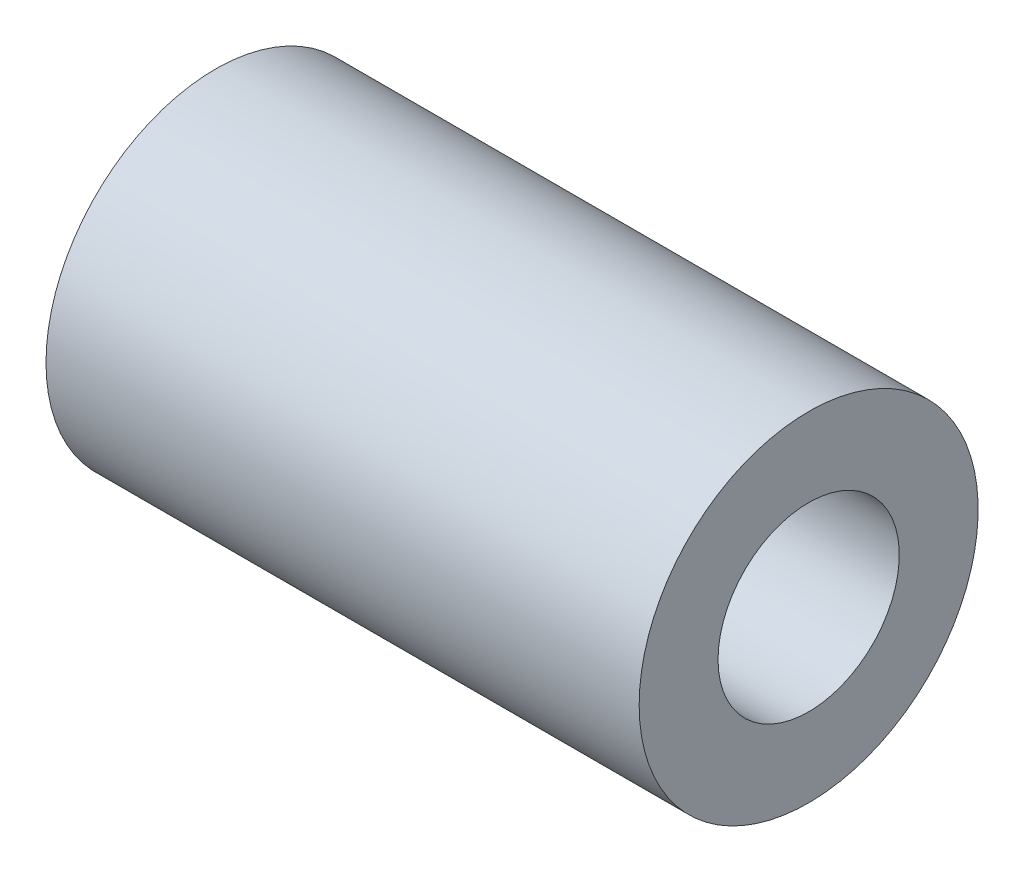
ISO-10303-21;
HEADER;
FILE_DESCRIPTION(('STEP AP214'),'2;1');
FILE_NAME('part.step','',(''),(''),'','','');
FILE_SCHEMA(('AUTOMOTIVE_DESIGN { 1 0 10303 214 1 1 1 1 }'));
ENDSEC;
DATA;
#1=APPLICATION_CONTEXT('core data for automotive mechanical design processes');
#2=APPLICATION_PROTOCOL_DEFINITION('international standard','automotive_design',2000,#1);
#3=PRODUCT_CONTEXT('',#1,'mechanical');
#4=PRODUCT('Part','Part','',(#3));
#5=PRODUCT_RELATED_PRODUCT_CATEGORY('part','',(#4));
#6=PRODUCT_DEFINITION_FORMATION('','',#4);
#7=PRODUCT_DEFINITION_CONTEXT('part definition',#1,'design');
#8=PRODUCT_DEFINITION('design','',#6,#7);
#9=PRODUCT_DEFINITION_SHAPE('','',#8);
#10=(LENGTH_UNIT() NAMED_UNIT(*) SI_UNIT(.MILLI.,.METRE.));
#11=(NAMED_UNIT(*) PLANE_ANGLE_UNIT() SI_UNIT($,.RADIAN.));
#12=(NAMED_UNIT(*) SI_UNIT($,.STERADIAN.) SOLID_ANGLE_UNIT());
#13=UNCERTAINTY_MEASURE_WITH_UNIT(LENGTH_MEASURE(1.E-05),#10,'distance_accuracy_value','');
#14=(GEOMETRIC_REPRESENTATION_CONTEXT(3) GLOBAL_UNCERTAINTY_ASSIGNED_CONTEXT((#13)) GLOBAL_UNIT_ASSIGNED_CONTEXT((#10,
#11,#12)) REPRESENTATION_CONTEXT('',''));
#15=CARTESIAN_POINT('',(0.,0.,0.));
#16=DIRECTION('',(0.,0.,1.));
#17=DIRECTION('',(1.,0.,0.));
#18=AXIS2_PLACEMENT_3D('',#15,#16,#17);
#19=CARTESIAN_POINT('',(0.,0.,0.));
#20=DIRECTION('',(-1.,0.,0.));
#21=DIRECTION('',(0.,0.,1.));
#22=AXIS2_PLACEMENT_3D('',#19,#20,#21);
#23=PLANE('',#22);
#24=CARTESIAN_POINT('',(0.,0.,0.));
#25=DIRECTION('',(-1.,0.,0.));
#26=DIRECTION('',(0.,0.,1.));
#27=AXIS2_PLACEMENT_3D('',#24,#25,#26);
#28=CIRCLE('',#27,5.5);
#29=CARTESIAN_POINT('',(0.,0.,5.5));
#30=VERTEX_POINT('',#29);
#31=EDGE_CURVE('E51',#30,#30,#28,.F.);
#32=ORIENTED_EDGE('',*,*,#31,.F.);
#33=EDGE_LOOP('',(#32));
#34=FACE_BOUND('',#33,.T.);
#35=CARTESIAN_POINT('',(0.,0.,0.));
#36=DIRECTION('',(-1.,0.,0.));
#37=DIRECTION('',(0.,0.,1.));
#38=AXIS2_PLACEMENT_3D('',#35,#36,#37);
#39=CIRCLE('',#38,10.287);
#40=CARTESIAN_POINT('',(0.,0.,10.287));
#41=VERTEX_POINT('',#40);
#42=EDGE_CURVE('E10',#41,#41,#39,.T.);
#43=ORIENTED_EDGE('',*,*,#42,.F.);
#44=EDGE_LOOP('',(#43));
#45=FACE_BOUND('',#44,.T.);
#46=ADVANCED_FACE('F39',(#34,#45),#23,.F.);
#47=CARTESIAN_POINT('',(-1000.,0.,0.));
#48=DIRECTION('',(-1.,0.,0.));
#49=DIRECTION('',(0.,0.,1.));
#50=AXIS2_PLACEMENT_3D('',#47,#48,#49);
#51=CYLINDRICAL_SURFACE('',#50,10.287);
#52=CARTESIAN_POINT('',(-36.,0.,0.));
#53=DIRECTION('',(-1.,0.,0.));
#54=DIRECTION('',(0.,0.,1.));
#55=AXIS2_PLACEMENT_3D('',#52,#53,#54);
#56=CIRCLE('',#55,10.287);
#57=CARTESIAN_POINT('',(-36.,0.,10.287));
#58=VERTEX_POINT('',#57);
#59=EDGE_CURVE('E46',#58,#58,#56,.T.);
#60=ORIENTED_EDGE('',*,*,#59,.F.);
#61=EDGE_LOOP('',(#60));
#62=FACE_BOUND('',#61,.T.);
#63=ORIENTED_EDGE('',*,*,#42,.T.);
#64=EDGE_LOOP('',(#63));
#65=FACE_BOUND('',#64,.T.);
#66=ADVANCED_FACE('F76',(#62,#65),#51,.T.);
#67=CARTESIAN_POINT('',(-36.,10.287,0.));
#68=DIRECTION('',(1.,0.,0.));
#69=DIRECTION('',(0.,0.,-1.));
#70=AXIS2_PLACEMENT_3D('',#67,#68,#69);
#71=PLANE('',#70);
#72=CARTESIAN_POINT('',(-36.,0.,0.));
#73=DIRECTION('',(1.,0.,0.));
#74=DIRECTION('',(0.,0.,-1.));
#75=AXIS2_PLACEMENT_3D('',#72,#73,#74);
#76=CIRCLE('',#75,3.175);
#77=CARTESIAN_POINT('',(-36.,0.,-3.175));
#78=VERTEX_POINT('',#77);
#79=EDGE_CURVE('E45',#78,#78,#76,.F.);
#80=ORIENTED_EDGE('',*,*,#79,.F.);
#81=EDGE_LOOP('',(#80));
#82=FACE_BOUND('',#81,.T.);
#83=ORIENTED_EDGE('',*,*,#59,.T.);
#84=EDGE_LOOP('',(#83));
#85=FACE_BOUND('',#84,.T.);
#86=ADVANCED_FACE('F78',(#82,#85),#71,.F.);
#87=CARTESIAN_POINT('',(-1000.,0.,0.));
#88=DIRECTION('',(-1.,0.,0.));
#89=DIRECTION('',(0.,0.,1.));
#90=AXIS2_PLACEMENT_3D('',#87,#88,#89);
#91=CYLINDRICAL_SURFACE('',#90,5.5);
#92=CARTESIAN_POINT('',(-14.,0.,0.));
#93=DIRECTION('',(-1.,0.,0.));
#94=DIRECTION('',(0.,0.,1.));
#95=AXIS2_PLACEMENT_3D('',#92,#93,#94);
#96=CIRCLE('',#95,5.5);
#97=CARTESIAN_POINT('',(-14.,0.,5.5));
#98=VERTEX_POINT('',#97);
#99=EDGE_CURVE('E54',#98,#98,#96,.T.);
#100=ORIENTED_EDGE('',*,*,#99,.T.);
#101=EDGE_LOOP('',(#100));
#102=FACE_BOUND('',#101,.T.);
#103=ORIENTED_EDGE('',*,*,#31,.T.);
#104=EDGE_LOOP('',(#103));
#105=FACE_BOUND('',#104,.T.);
#106=ADVANCED_FACE('F80',(#102,#105),#91,.F.);
#107=CARTESIAN_POINT('',(-14.,5.5,0.));
#108=DIRECTION('',(1.,0.,0.));
#109=DIRECTION('',(0.,0.,-1.));
#110=AXIS2_PLACEMENT_3D('',#107,#108,#109);
#111=PLANE('',#110);
#112=ORIENTED_EDGE('',*,*,#99,.F.);
#113=EDGE_LOOP('',(#112));
#114=FACE_BOUND('',#113,.T.);
#115=ADVANCED_FACE('F75',(#114),#111,.T.);
#116=CARTESIAN_POINT('',(-1000.,0.,0.));
#117=DIRECTION('',(-1.,0.,0.));
#118=DIRECTION('',(0.,0.,1.));
#119=AXIS2_PLACEMENT_3D('',#116,#117,#118);
#120=CYLINDRICAL_SURFACE('',#119,3.175);
#121=CARTESIAN_POINT('',(-20.8,0.,0.));
#122=DIRECTION('',(-1.,0.,0.));
#123=DIRECTION('',(0.,0.,1.));
#124=AXIS2_PLACEMENT_3D('',#121,#122,#123);
#125=CIRCLE('',#124,3.175);
#126=CARTESIAN_POINT('',(-20.8,0.,3.175));
#127=VERTEX_POINT('',#126);
#128=EDGE_CURVE('E64',#127,#127,#125,.T.);
#129=ORIENTED_EDGE('',*,*,#128,.F.);
#130=EDGE_LOOP('',(#129));
#131=FACE_BOUND('',#130,.T.);
#132=ORIENTED_EDGE('',*,*,#79,.T.);
#133=EDGE_LOOP('',(#132));
#134=FACE_BOUND('',#133,.T.);
#135=ADVANCED_FACE('F69',(#131,#134),#120,.F.);
#136=CARTESIAN_POINT('',(-20.8,3.175,0.));
#137=DIRECTION('',(-1.,0.,0.));
#138=DIRECTION('',(0.,0.,1.));
#139=AXIS2_PLACEMENT_3D('',#136,#137,#138);
#140=PLANE('',#139);
#141=ORIENTED_EDGE('',*,*,#128,.T.);
#142=EDGE_LOOP('',(#141));
#143=FACE_BOUND('',#142,.T.);
#144=ADVANCED_FACE('F70',(#143),#140,.T.);
#145=CLOSED_SHELL('',(#46,#66,#86,#106,#115,#135,#144));
#146=MANIFOLD_SOLID_BREP('B2',#145);
#147=ADVANCED_BREP_SHAPE_REPRESENTATION('',(#18,#146),#14);
#148=SHAPE_DEFINITION_REPRESENTATION(#9,#147);
ENDSEC;
END-ISO-10303-21;
